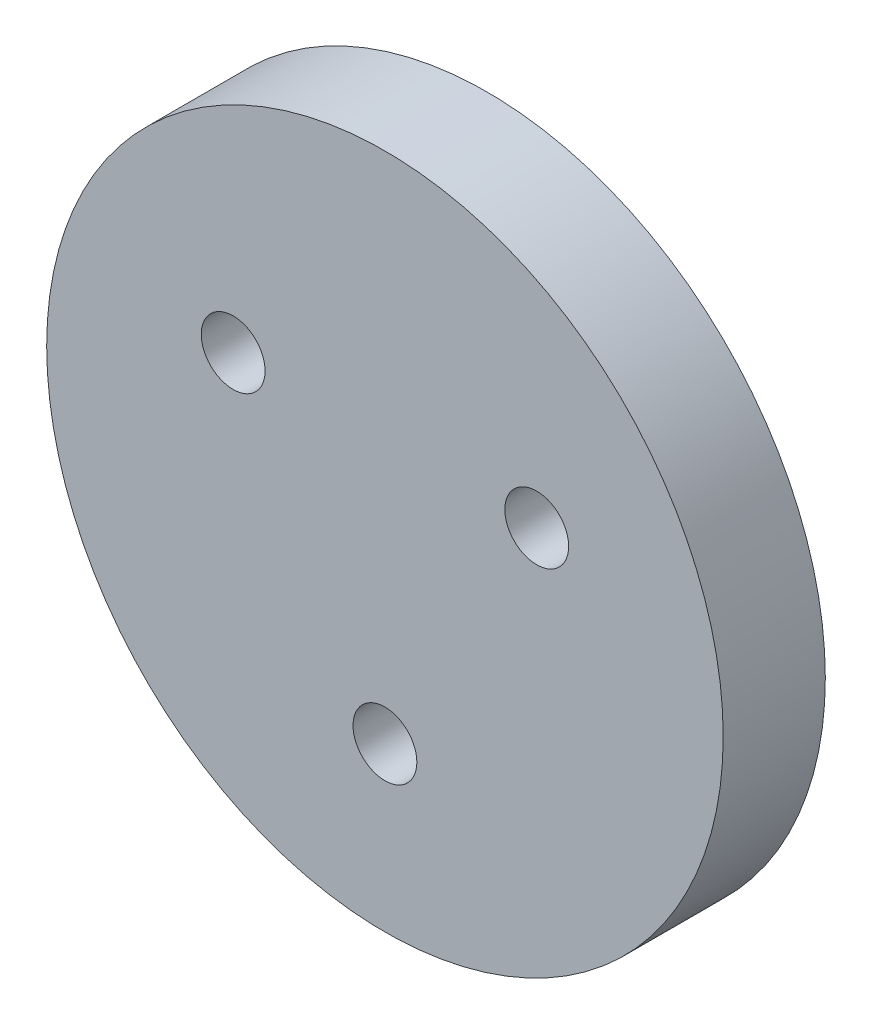
ISO-10303-21;
HEADER;
FILE_DESCRIPTION(('STEP AP214'),'2;1');
FILE_NAME('part.step','',(''),(''),'','','');
FILE_SCHEMA(('AUTOMOTIVE_DESIGN { 1 0 10303 214 1 1 1 1 }'));
ENDSEC;
DATA;
#1=APPLICATION_CONTEXT('core data for automotive mechanical design processes');
#2=APPLICATION_PROTOCOL_DEFINITION('international standard','automotive_design',2000,#1);
#3=PRODUCT_CONTEXT('',#1,'mechanical');
#4=PRODUCT('Part','Part','',(#3));
#5=PRODUCT_RELATED_PRODUCT_CATEGORY('part','',(#4));
#6=PRODUCT_DEFINITION_FORMATION('','',#4);
#7=PRODUCT_DEFINITION_CONTEXT('part definition',#1,'design');
#8=PRODUCT_DEFINITION('design','',#6,#7);
#9=PRODUCT_DEFINITION_SHAPE('','',#8);
#10=(LENGTH_UNIT() NAMED_UNIT(*) SI_UNIT(.MILLI.,.METRE.));
#11=(NAMED_UNIT(*) PLANE_ANGLE_UNIT() SI_UNIT($,.RADIAN.));
#12=(NAMED_UNIT(*) SI_UNIT($,.STERADIAN.) SOLID_ANGLE_UNIT());
#13=UNCERTAINTY_MEASURE_WITH_UNIT(LENGTH_MEASURE(1.E-05),#10,'distance_accuracy_value','');
#14=(GEOMETRIC_REPRESENTATION_CONTEXT(3) GLOBAL_UNCERTAINTY_ASSIGNED_CONTEXT((#13)) GLOBAL_UNIT_ASSIGNED_CONTEXT((#10,
#11,#12)) REPRESENTATION_CONTEXT('',''));
#15=CARTESIAN_POINT('',(0.,0.,0.));
#16=DIRECTION('',(0.,0.,1.));
#17=DIRECTION('',(1.,0.,0.));
#18=AXIS2_PLACEMENT_3D('',#15,#16,#17);
#19=CARTESIAN_POINT('',(0.,0.,8.));
#20=DIRECTION('',(0.,0.,1.));
#21=DIRECTION('',(1.,0.,0.));
#22=AXIS2_PLACEMENT_3D('',#19,#20,#21);
#23=PLANE('',#22);
#24=CARTESIAN_POINT('',(-11.8905287939603,6.865,8.));
#25=DIRECTION('',(0.,0.,1.));
#26=DIRECTION('',(1.,0.,0.));
#27=AXIS2_PLACEMENT_3D('',#24,#25,#26);
#28=CIRCLE('',#27,2.5);
#29=CARTESIAN_POINT('',(-9.39052879396035,6.865,8.));
#30=VERTEX_POINT('',#29);
#31=EDGE_CURVE('E51',#30,#30,#28,.T.);
#32=ORIENTED_EDGE('',*,*,#31,.F.);
#33=EDGE_LOOP('',(#32));
#34=FACE_BOUND('',#33,.T.);
#35=CARTESIAN_POINT('',(0.,0.,8.));
#36=DIRECTION('',(0.,0.,1.));
#37=DIRECTION('',(1.,0.,0.));
#38=AXIS2_PLACEMENT_3D('',#35,#36,#37);
#39=CIRCLE('',#38,26.5);
#40=CARTESIAN_POINT('',(26.5,0.,8.));
#41=VERTEX_POINT('',#40);
#42=EDGE_CURVE('E10',#41,#41,#39,.T.);
#43=ORIENTED_EDGE('',*,*,#42,.T.);
#44=EDGE_LOOP('',(#43));
#45=FACE_BOUND('',#44,.T.);
#46=CARTESIAN_POINT('',(0.,-13.73,8.));
#47=DIRECTION('',(0.,0.,1.));
#48=DIRECTION('',(1.,0.,0.));
#49=AXIS2_PLACEMENT_3D('',#46,#47,#48);
#50=CIRCLE('',#49,2.5);
#51=CARTESIAN_POINT('',(2.5,-13.73,8.));
#52=VERTEX_POINT('',#51);
#53=EDGE_CURVE('E46',#52,#52,#50,.T.);
#54=ORIENTED_EDGE('',*,*,#53,.F.);
#55=EDGE_LOOP('',(#54));
#56=FACE_BOUND('',#55,.T.);
#57=CARTESIAN_POINT('',(11.8905287939603,6.86500000000001,8.));
#58=DIRECTION('',(0.,0.,1.));
#59=DIRECTION('',(1.,0.,0.));
#60=AXIS2_PLACEMENT_3D('',#57,#58,#59);
#61=CIRCLE('',#60,2.5);
#62=CARTESIAN_POINT('',(14.3905287939603,6.86500000000001,8.));
#63=VERTEX_POINT('',#62);
#64=EDGE_CURVE('E57',#63,#63,#61,.T.);
#65=ORIENTED_EDGE('',*,*,#64,.F.);
#66=EDGE_LOOP('',(#65));
#67=FACE_BOUND('',#66,.T.);
#68=ADVANCED_FACE('F35',(#34,#45,#56,#67),#23,.T.);
#69=CARTESIAN_POINT('',(0.,0.,0.));
#70=DIRECTION('',(0.,0.,1.));
#71=DIRECTION('',(1.,0.,0.));
#72=AXIS2_PLACEMENT_3D('',#69,#70,#71);
#73=PLANE('',#72);
#74=CARTESIAN_POINT('',(0.,0.,0.));
#75=DIRECTION('',(0.,0.,1.));
#76=DIRECTION('',(1.,0.,0.));
#77=AXIS2_PLACEMENT_3D('',#74,#75,#76);
#78=CIRCLE('',#77,26.5);
#79=CARTESIAN_POINT('',(26.5,0.,0.));
#80=VERTEX_POINT('',#79);
#81=EDGE_CURVE('E39',#80,#80,#78,.T.);
#82=ORIENTED_EDGE('',*,*,#81,.F.);
#83=EDGE_LOOP('',(#82));
#84=FACE_BOUND('',#83,.T.);
#85=CARTESIAN_POINT('',(0.,-13.73,0.));
#86=DIRECTION('',(0.,0.,1.));
#87=DIRECTION('',(1.,0.,0.));
#88=AXIS2_PLACEMENT_3D('',#85,#86,#87);
#89=CIRCLE('',#88,2.5);
#90=CARTESIAN_POINT('',(2.5,-13.73,0.));
#91=VERTEX_POINT('',#90);
#92=EDGE_CURVE('E48',#91,#91,#89,.T.);
#93=ORIENTED_EDGE('',*,*,#92,.T.);
#94=EDGE_LOOP('',(#93));
#95=FACE_BOUND('',#94,.T.);
#96=CARTESIAN_POINT('',(-11.8905287939603,6.865,0.));
#97=DIRECTION('',(0.,0.,1.));
#98=DIRECTION('',(1.,0.,0.));
#99=AXIS2_PLACEMENT_3D('',#96,#97,#98);
#100=CIRCLE('',#99,2.5);
#101=CARTESIAN_POINT('',(-9.39052879396035,6.865,0.));
#102=VERTEX_POINT('',#101);
#103=EDGE_CURVE('E54',#102,#102,#100,.T.);
#104=ORIENTED_EDGE('',*,*,#103,.T.);
#105=EDGE_LOOP('',(#104));
#106=FACE_BOUND('',#105,.T.);
#107=CARTESIAN_POINT('',(11.8905287939603,6.86500000000001,0.));
#108=DIRECTION('',(0.,0.,1.));
#109=DIRECTION('',(1.,0.,0.));
#110=AXIS2_PLACEMENT_3D('',#107,#108,#109);
#111=CIRCLE('',#110,2.5);
#112=CARTESIAN_POINT('',(14.3905287939603,6.86500000000001,0.));
#113=VERTEX_POINT('',#112);
#114=EDGE_CURVE('E60',#113,#113,#111,.T.);
#115=ORIENTED_EDGE('',*,*,#114,.T.);
#116=EDGE_LOOP('',(#115));
#117=FACE_BOUND('',#116,.T.);
#118=ADVANCED_FACE('F70',(#84,#95,#106,#117),#73,.F.);
#119=CARTESIAN_POINT('',(0.,0.,8.));
#120=DIRECTION('',(0.,0.,-1.));
#121=DIRECTION('',(-1.,0.,0.));
#122=AXIS2_PLACEMENT_3D('',#119,#120,#121);
#123=CYLINDRICAL_SURFACE('',#122,26.5);
#124=ORIENTED_EDGE('',*,*,#42,.F.);
#125=EDGE_LOOP('',(#124));
#126=FACE_BOUND('',#125,.T.);
#127=ORIENTED_EDGE('',*,*,#81,.T.);
#128=EDGE_LOOP('',(#127));
#129=FACE_BOUND('',#128,.T.);
#130=ADVANCED_FACE('F37',(#126,#129),#123,.T.);
#131=CARTESIAN_POINT('',(0.,-13.73,8.));
#132=DIRECTION('',(0.,0.,-1.));
#133=DIRECTION('',(-1.,0.,0.));
#134=AXIS2_PLACEMENT_3D('',#131,#132,#133);
#135=CYLINDRICAL_SURFACE('',#134,2.5);
#136=ORIENTED_EDGE('',*,*,#53,.T.);
#137=EDGE_LOOP('',(#136));
#138=FACE_BOUND('',#137,.T.);
#139=ORIENTED_EDGE('',*,*,#92,.F.);
#140=EDGE_LOOP('',(#139));
#141=FACE_BOUND('',#140,.T.);
#142=ADVANCED_FACE('F79',(#138,#141),#135,.F.);
#143=CARTESIAN_POINT('',(-11.8905287939603,6.865,8.));
#144=DIRECTION('',(0.,0.,-1.));
#145=DIRECTION('',(-1.,0.,0.));
#146=AXIS2_PLACEMENT_3D('',#143,#144,#145);
#147=CYLINDRICAL_SURFACE('',#146,2.5);
#148=ORIENTED_EDGE('',*,*,#31,.T.);
#149=EDGE_LOOP('',(#148));
#150=FACE_BOUND('',#149,.T.);
#151=ORIENTED_EDGE('',*,*,#103,.F.);
#152=EDGE_LOOP('',(#151));
#153=FACE_BOUND('',#152,.T.);
#154=ADVANCED_FACE('F82',(#150,#153),#147,.F.);
#155=CARTESIAN_POINT('',(11.8905287939603,6.86500000000001,8.));
#156=DIRECTION('',(0.,0.,-1.));
#157=DIRECTION('',(-1.,0.,0.));
#158=AXIS2_PLACEMENT_3D('',#155,#156,#157);
#159=CYLINDRICAL_SURFACE('',#158,2.5);
#160=ORIENTED_EDGE('',*,*,#64,.T.);
#161=EDGE_LOOP('',(#160));
#162=FACE_BOUND('',#161,.T.);
#163=ORIENTED_EDGE('',*,*,#114,.F.);
#164=EDGE_LOOP('',(#163));
#165=FACE_BOUND('',#164,.T.);
#166=ADVANCED_FACE('F66',(#162,#165),#159,.F.);
#167=CLOSED_SHELL('',(#68,#118,#130,#142,#154,#166));
#168=MANIFOLD_SOLID_BREP('B2',#167);
#169=ADVANCED_BREP_SHAPE_REPRESENTATION('',(#18,#168),#14);
#170=SHAPE_DEFINITION_REPRESENTATION(#9,#169);
ENDSEC;
END-ISO-10303-21;
